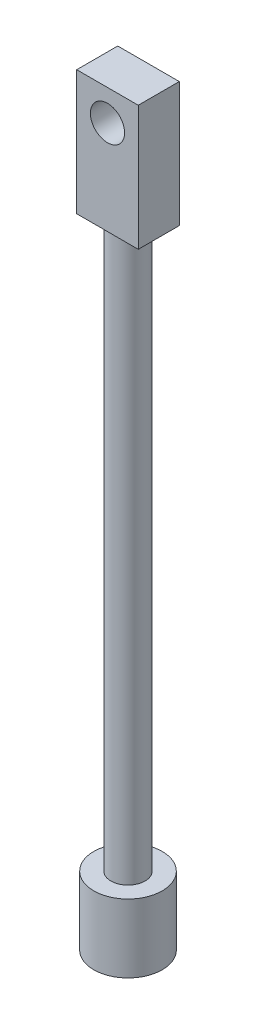
ISO-10303-21;
HEADER;
FILE_DESCRIPTION(('STEP AP214'),'2;1');
FILE_NAME('part.step','',(''),(''),'','','');
FILE_SCHEMA(('AUTOMOTIVE_DESIGN { 1 0 10303 214 1 1 1 1 }'));
ENDSEC;
DATA;
#1=APPLICATION_CONTEXT('core data for automotive mechanical design processes');
#2=APPLICATION_PROTOCOL_DEFINITION('international standard','automotive_design',2000,#1);
#3=PRODUCT_CONTEXT('',#1,'mechanical');
#4=PRODUCT('Part','Part','',(#3));
#5=PRODUCT_RELATED_PRODUCT_CATEGORY('part','',(#4));
#6=PRODUCT_DEFINITION_FORMATION('','',#4);
#7=PRODUCT_DEFINITION_CONTEXT('part definition',#1,'design');
#8=PRODUCT_DEFINITION('design','',#6,#7);
#9=PRODUCT_DEFINITION_SHAPE('','',#8);
#10=(LENGTH_UNIT() NAMED_UNIT(*) SI_UNIT(.MILLI.,.METRE.));
#11=(NAMED_UNIT(*) PLANE_ANGLE_UNIT() SI_UNIT($,.RADIAN.));
#12=(NAMED_UNIT(*) SI_UNIT($,.STERADIAN.) SOLID_ANGLE_UNIT());
#13=UNCERTAINTY_MEASURE_WITH_UNIT(LENGTH_MEASURE(1.E-05),#10,'distance_accuracy_value','');
#14=(GEOMETRIC_REPRESENTATION_CONTEXT(3) GLOBAL_UNCERTAINTY_ASSIGNED_CONTEXT((#13)) GLOBAL_UNIT_ASSIGNED_CONTEXT((#10,
#11,#12)) REPRESENTATION_CONTEXT('',''));
#15=CARTESIAN_POINT('',(0.,0.,0.));
#16=DIRECTION('',(0.,0.,1.));
#17=DIRECTION('',(1.,0.,0.));
#18=AXIS2_PLACEMENT_3D('',#15,#16,#17);
#19=CARTESIAN_POINT('',(0.,-40.,0.));
#20=DIRECTION('',(0.,-1.,0.));
#21=DIRECTION('',(0.,0.,-1.));
#22=AXIS2_PLACEMENT_3D('',#19,#20,#21);
#23=CYLINDRICAL_SURFACE('',#22,5.00000000000002);
#24=CARTESIAN_POINT('',(0.,165.,0.));
#25=DIRECTION('',(0.,1.,0.));
#26=DIRECTION('',(0.,0.,1.));
#27=AXIS2_PLACEMENT_3D('',#24,#25,#26);
#28=CIRCLE('',#27,5.00000000000002);
#29=CARTESIAN_POINT('',(0.,165.,5.00000000000002));
#30=VERTEX_POINT('',#29);
#31=EDGE_CURVE('E95',#30,#30,#28,.F.);
#32=ORIENTED_EDGE('',*,*,#31,.T.);
#33=EDGE_LOOP('',(#32));
#34=FACE_BOUND('',#33,.T.);
#35=CARTESIAN_POINT('',(0.,0.,0.));
#36=DIRECTION('',(0.,-1.,0.));
#37=DIRECTION('',(0.,0.,-1.));
#38=AXIS2_PLACEMENT_3D('',#35,#36,#37);
#39=CIRCLE('',#38,5.00000000000002);
#40=CARTESIAN_POINT('',(0.,0.,-5.00000000000002));
#41=VERTEX_POINT('',#40);
#42=EDGE_CURVE('E11',#41,#41,#39,.T.);
#43=ORIENTED_EDGE('',*,*,#42,.F.);
#44=EDGE_LOOP('',(#43));
#45=FACE_BOUND('',#44,.T.);
#46=ADVANCED_FACE('F37',(#34,#45),#23,.T.);
#47=CARTESIAN_POINT('',(10.,0.,0.));
#48=DIRECTION('',(0.,-1.,0.));
#49=DIRECTION('',(0.,0.,-1.));
#50=AXIS2_PLACEMENT_3D('',#47,#48,#49);
#51=PLANE('',#50);
#52=ORIENTED_EDGE('',*,*,#42,.T.);
#53=EDGE_LOOP('',(#52));
#54=FACE_BOUND('',#53,.T.);
#55=CARTESIAN_POINT('',(0.,0.,0.));
#56=DIRECTION('',(0.,1.,0.));
#57=DIRECTION('',(0.,0.,1.));
#58=AXIS2_PLACEMENT_3D('',#55,#56,#57);
#59=CIRCLE('',#58,10.);
#60=CARTESIAN_POINT('',(0.,0.,10.));
#61=VERTEX_POINT('',#60);
#62=EDGE_CURVE('E44',#61,#61,#59,.T.);
#63=ORIENTED_EDGE('',*,*,#62,.T.);
#64=EDGE_LOOP('',(#63));
#65=FACE_BOUND('',#64,.T.);
#66=ADVANCED_FACE('F129',(#54,#65),#51,.F.);
#67=CARTESIAN_POINT('',(0.,0.,0.));
#68=DIRECTION('',(0.,1.,0.));
#69=DIRECTION('',(0.,0.,1.));
#70=AXIS2_PLACEMENT_3D('',#67,#68,#69);
#71=CYLINDRICAL_SURFACE('',#70,10.);
#72=ORIENTED_EDGE('',*,*,#62,.F.);
#73=EDGE_LOOP('',(#72));
#74=FACE_BOUND('',#73,.T.);
#75=CARTESIAN_POINT('',(0.,-20.,0.));
#76=DIRECTION('',(0.,1.,0.));
#77=DIRECTION('',(0.,0.,1.));
#78=AXIS2_PLACEMENT_3D('',#75,#76,#77);
#79=CIRCLE('',#78,10.);
#80=CARTESIAN_POINT('',(0.,-20.,10.));
#81=VERTEX_POINT('',#80);
#82=EDGE_CURVE('E124',#81,#81,#79,.T.);
#83=ORIENTED_EDGE('',*,*,#82,.T.);
#84=EDGE_LOOP('',(#83));
#85=FACE_BOUND('',#84,.T.);
#86=ADVANCED_FACE('F131',(#74,#85),#71,.T.);
#87=CARTESIAN_POINT('',(0.,-20.,0.));
#88=DIRECTION('',(0.,1.,0.));
#89=DIRECTION('',(0.,0.,1.));
#90=AXIS2_PLACEMENT_3D('',#87,#88,#89);
#91=PLANE('',#90);
#92=ORIENTED_EDGE('',*,*,#82,.F.);
#93=EDGE_LOOP('',(#92));
#94=FACE_BOUND('',#93,.T.);
#95=ADVANCED_FACE('F134',(#94),#91,.F.);
#96=CARTESIAN_POINT('',(-9.,201.5,6.));
#97=DIRECTION('',(0.,0.,-1.));
#98=DIRECTION('',(-1.,0.,0.));
#99=AXIS2_PLACEMENT_3D('',#96,#97,#98);
#100=PLANE('',#99);
#101=DIRECTION('',(-1.,0.,0.));
#102=VECTOR('',#101,1.);
#103=CARTESIAN_POINT('',(9.,201.5,6.));
#104=LINE('',#103,#102);
#105=CARTESIAN_POINT('',(9.,201.5,6.));
#106=VERTEX_POINT('',#105);
#107=CARTESIAN_POINT('',(-9.,201.5,6.));
#108=VERTEX_POINT('',#107);
#109=EDGE_CURVE('E111',#106,#108,#104,.T.);
#110=ORIENTED_EDGE('',*,*,#109,.T.);
#111=DIRECTION('',(0.,-1.,0.));
#112=VECTOR('',#111,1.);
#113=CARTESIAN_POINT('',(-9.,165.,6.));
#114=LINE('',#113,#112);
#115=CARTESIAN_POINT('',(-9.,165.,6.));
#116=VERTEX_POINT('',#115);
#117=EDGE_CURVE('E92',#108,#116,#114,.T.);
#118=ORIENTED_EDGE('',*,*,#117,.T.);
#119=DIRECTION('',(1.,0.,0.));
#120=VECTOR('',#119,1.);
#121=CARTESIAN_POINT('',(-9.,165.,6.));
#122=LINE('',#121,#120);
#123=CARTESIAN_POINT('',(9.,165.,6.));
#124=VERTEX_POINT('',#123);
#125=EDGE_CURVE('E56',#116,#124,#122,.T.);
#126=ORIENTED_EDGE('',*,*,#125,.T.);
#127=DIRECTION('',(0.,1.,0.));
#128=VECTOR('',#127,1.);
#129=CARTESIAN_POINT('',(9.,165.,6.));
#130=LINE('',#129,#128);
#131=EDGE_CURVE('E51',#124,#106,#130,.T.);
#132=ORIENTED_EDGE('',*,*,#131,.T.);
#133=EDGE_LOOP('',(#110,#118,#126,#132));
#134=FACE_BOUND('',#133,.T.);
#135=CARTESIAN_POINT('',(0.,192.5,6.));
#136=DIRECTION('',(0.,0.,1.));
#137=DIRECTION('',(1.,0.,0.));
#138=AXIS2_PLACEMENT_3D('',#135,#136,#137);
#139=CIRCLE('',#138,5.);
#140=CARTESIAN_POINT('',(5.,192.5,6.));
#141=VERTEX_POINT('',#140);
#142=EDGE_CURVE('E101',#141,#141,#139,.T.);
#143=ORIENTED_EDGE('',*,*,#142,.F.);
#144=EDGE_LOOP('',(#143));
#145=FACE_BOUND('',#144,.T.);
#146=ADVANCED_FACE('F139',(#134,#145),#100,.F.);
#147=CARTESIAN_POINT('',(-9.,201.5,-6.));
#148=DIRECTION('',(0.,0.,-1.));
#149=DIRECTION('',(-1.,0.,0.));
#150=AXIS2_PLACEMENT_3D('',#147,#148,#149);
#151=PLANE('',#150);
#152=DIRECTION('',(-1.,0.,0.));
#153=VECTOR('',#152,1.);
#154=CARTESIAN_POINT('',(9.,201.5,-6.));
#155=LINE('',#154,#153);
#156=CARTESIAN_POINT('',(9.,201.5,-6.));
#157=VERTEX_POINT('',#156);
#158=CARTESIAN_POINT('',(-9.,201.5,-6.));
#159=VERTEX_POINT('',#158);
#160=EDGE_CURVE('E83',#157,#159,#155,.T.);
#161=ORIENTED_EDGE('',*,*,#160,.F.);
#162=DIRECTION('',(0.,1.,0.));
#163=VECTOR('',#162,1.);
#164=CARTESIAN_POINT('',(9.,165.,-6.));
#165=LINE('',#164,#163);
#166=CARTESIAN_POINT('',(9.,165.,-6.));
#167=VERTEX_POINT('',#166);
#168=EDGE_CURVE('E109',#167,#157,#165,.T.);
#169=ORIENTED_EDGE('',*,*,#168,.F.);
#170=DIRECTION('',(1.,0.,0.));
#171=VECTOR('',#170,1.);
#172=CARTESIAN_POINT('',(-9.,165.,-6.));
#173=LINE('',#172,#171);
#174=CARTESIAN_POINT('',(-9.,165.,-6.));
#175=VERTEX_POINT('',#174);
#176=EDGE_CURVE('E84',#175,#167,#173,.T.);
#177=ORIENTED_EDGE('',*,*,#176,.F.);
#178=DIRECTION('',(0.,-1.,0.));
#179=VECTOR('',#178,1.);
#180=CARTESIAN_POINT('',(-9.,165.,-6.));
#181=LINE('',#180,#179);
#182=EDGE_CURVE('E77',#159,#175,#181,.T.);
#183=ORIENTED_EDGE('',*,*,#182,.F.);
#184=EDGE_LOOP('',(#161,#169,#177,#183));
#185=FACE_BOUND('',#184,.T.);
#186=CARTESIAN_POINT('',(0.,192.5,-6.));
#187=DIRECTION('',(0.,0.,1.));
#188=DIRECTION('',(1.,0.,0.));
#189=AXIS2_PLACEMENT_3D('',#186,#187,#188);
#190=CIRCLE('',#189,5.);
#191=CARTESIAN_POINT('',(5.,192.5,-6.));
#192=VERTEX_POINT('',#191);
#193=EDGE_CURVE('E104',#192,#192,#190,.T.);
#194=ORIENTED_EDGE('',*,*,#193,.T.);
#195=EDGE_LOOP('',(#194));
#196=FACE_BOUND('',#195,.T.);
#197=ADVANCED_FACE('F79',(#185,#196),#151,.T.);
#198=CARTESIAN_POINT('',(9.,201.5,6.));
#199=DIRECTION('',(0.,-1.,0.));
#200=DIRECTION('',(0.,0.,-1.));
#201=AXIS2_PLACEMENT_3D('',#198,#199,#200);
#202=PLANE('',#201);
#203=ORIENTED_EDGE('',*,*,#160,.T.);
#204=DIRECTION('',(0.,0.,-1.));
#205=VECTOR('',#204,1.);
#206=CARTESIAN_POINT('',(-9.,201.5,6.));
#207=LINE('',#206,#205);
#208=EDGE_CURVE('E90',#108,#159,#207,.T.);
#209=ORIENTED_EDGE('',*,*,#208,.F.);
#210=ORIENTED_EDGE('',*,*,#109,.F.);
#211=DIRECTION('',(0.,0.,-1.));
#212=VECTOR('',#211,1.);
#213=CARTESIAN_POINT('',(9.,201.5,6.));
#214=LINE('',#213,#212);
#215=EDGE_CURVE('E100',#106,#157,#214,.T.);
#216=ORIENTED_EDGE('',*,*,#215,.T.);
#217=EDGE_LOOP('',(#203,#209,#210,#216));
#218=FACE_BOUND('',#217,.T.);
#219=ADVANCED_FACE('F99',(#218),#202,.F.);
#220=CARTESIAN_POINT('',(-9.,165.,6.));
#221=DIRECTION('',(1.,0.,0.));
#222=DIRECTION('',(0.,0.,-1.));
#223=AXIS2_PLACEMENT_3D('',#220,#221,#222);
#224=PLANE('',#223);
#225=ORIENTED_EDGE('',*,*,#182,.T.);
#226=DIRECTION('',(0.,0.,-1.));
#227=VECTOR('',#226,1.);
#228=CARTESIAN_POINT('',(-9.,165.,6.));
#229=LINE('',#228,#227);
#230=EDGE_CURVE('E96',#116,#175,#229,.T.);
#231=ORIENTED_EDGE('',*,*,#230,.F.);
#232=ORIENTED_EDGE('',*,*,#117,.F.);
#233=ORIENTED_EDGE('',*,*,#208,.T.);
#234=EDGE_LOOP('',(#225,#231,#232,#233));
#235=FACE_BOUND('',#234,.T.);
#236=ADVANCED_FACE('F91',(#235),#224,.F.);
#237=CARTESIAN_POINT('',(-9.,165.,6.));
#238=DIRECTION('',(0.,1.,0.));
#239=DIRECTION('',(0.,0.,1.));
#240=AXIS2_PLACEMENT_3D('',#237,#238,#239);
#241=PLANE('',#240);
#242=ORIENTED_EDGE('',*,*,#31,.F.);
#243=EDGE_LOOP('',(#242));
#244=FACE_BOUND('',#243,.T.);
#245=ORIENTED_EDGE('',*,*,#176,.T.);
#246=DIRECTION('',(0.,0.,-1.));
#247=VECTOR('',#246,1.);
#248=CARTESIAN_POINT('',(9.,165.,6.));
#249=LINE('',#248,#247);
#250=EDGE_CURVE('E117',#124,#167,#249,.T.);
#251=ORIENTED_EDGE('',*,*,#250,.F.);
#252=ORIENTED_EDGE('',*,*,#125,.F.);
#253=ORIENTED_EDGE('',*,*,#230,.T.);
#254=EDGE_LOOP('',(#245,#251,#252,#253));
#255=FACE_BOUND('',#254,.T.);
#256=ADVANCED_FACE('F156',(#244,#255),#241,.F.);
#257=CARTESIAN_POINT('',(9.,165.,6.));
#258=DIRECTION('',(-1.,0.,0.));
#259=DIRECTION('',(0.,0.,1.));
#260=AXIS2_PLACEMENT_3D('',#257,#258,#259);
#261=PLANE('',#260);
#262=ORIENTED_EDGE('',*,*,#168,.T.);
#263=ORIENTED_EDGE('',*,*,#215,.F.);
#264=ORIENTED_EDGE('',*,*,#131,.F.);
#265=ORIENTED_EDGE('',*,*,#250,.T.);
#266=EDGE_LOOP('',(#262,#263,#264,#265));
#267=FACE_BOUND('',#266,.T.);
#268=ADVANCED_FACE('F159',(#267),#261,.F.);
#269=CARTESIAN_POINT('',(0.,192.5,6.));
#270=DIRECTION('',(0.,0.,-1.));
#271=DIRECTION('',(-1.,0.,0.));
#272=AXIS2_PLACEMENT_3D('',#269,#270,#271);
#273=CYLINDRICAL_SURFACE('',#272,5.);
#274=ORIENTED_EDGE('',*,*,#142,.T.);
#275=EDGE_LOOP('',(#274));
#276=FACE_BOUND('',#275,.T.);
#277=ORIENTED_EDGE('',*,*,#193,.F.);
#278=EDGE_LOOP('',(#277));
#279=FACE_BOUND('',#278,.T.);
#280=ADVANCED_FACE('F165',(#276,#279),#273,.F.);
#281=CLOSED_SHELL('',(#46,#66,#86,#95,#146,#197,#219,#236,#256,#268,#280));
#282=MANIFOLD_SOLID_BREP('B2',#281);
#283=ADVANCED_BREP_SHAPE_REPRESENTATION('',(#18,#282),#14);
#284=SHAPE_DEFINITION_REPRESENTATION(#9,#283);
ENDSEC;
END-ISO-10303-21;
